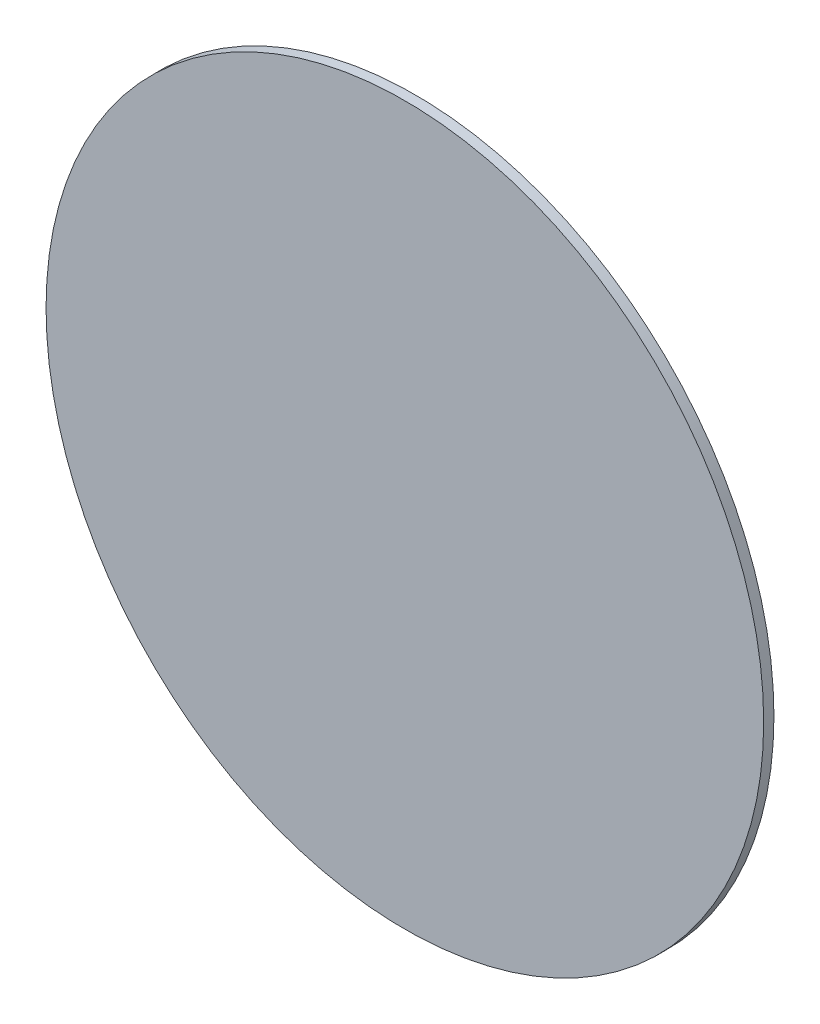
ISO-10303-21;
HEADER;
FILE_DESCRIPTION(('STEP AP214'),'2;1');
FILE_NAME('part.step','',(''),(''),'','','');
FILE_SCHEMA(('AUTOMOTIVE_DESIGN { 1 0 10303 214 1 1 1 1 }'));
ENDSEC;
DATA;
#1=APPLICATION_CONTEXT('core data for automotive mechanical design processes');
#2=APPLICATION_PROTOCOL_DEFINITION('international standard','automotive_design',2000,#1);
#3=PRODUCT_CONTEXT('',#1,'mechanical');
#4=PRODUCT('Part','Part','',(#3));
#5=PRODUCT_RELATED_PRODUCT_CATEGORY('part','',(#4));
#6=PRODUCT_DEFINITION_FORMATION('','',#4);
#7=PRODUCT_DEFINITION_CONTEXT('part definition',#1,'design');
#8=PRODUCT_DEFINITION('design','',#6,#7);
#9=PRODUCT_DEFINITION_SHAPE('','',#8);
#10=(LENGTH_UNIT() NAMED_UNIT(*) SI_UNIT(.MILLI.,.METRE.));
#11=(NAMED_UNIT(*) PLANE_ANGLE_UNIT() SI_UNIT($,.RADIAN.));
#12=(NAMED_UNIT(*) SI_UNIT($,.STERADIAN.) SOLID_ANGLE_UNIT());
#13=UNCERTAINTY_MEASURE_WITH_UNIT(LENGTH_MEASURE(1.E-05),#10,'distance_accuracy_value','');
#14=(GEOMETRIC_REPRESENTATION_CONTEXT(3) GLOBAL_UNCERTAINTY_ASSIGNED_CONTEXT((#13)) GLOBAL_UNIT_ASSIGNED_CONTEXT((#10,
#11,#12)) REPRESENTATION_CONTEXT('',''));
#15=CARTESIAN_POINT('',(0.,0.,0.));
#16=DIRECTION('',(0.,0.,1.));
#17=DIRECTION('',(1.,0.,0.));
#18=AXIS2_PLACEMENT_3D('',#15,#16,#17);
#19=CARTESIAN_POINT('',(0.,0.,5.));
#20=DIRECTION('',(0.,0.,-1.));
#21=DIRECTION('',(-1.,0.,0.));
#22=AXIS2_PLACEMENT_3D('',#19,#20,#21);
#23=CYLINDRICAL_SURFACE('',#22,175.);
#24=CARTESIAN_POINT('',(0.,0.,5.));
#25=DIRECTION('',(0.,0.,1.));
#26=DIRECTION('',(1.,0.,0.));
#27=AXIS2_PLACEMENT_3D('',#24,#25,#26);
#28=CIRCLE('',#27,175.);
#29=CARTESIAN_POINT('',(175.,0.,5.));
#30=VERTEX_POINT('',#29);
#31=EDGE_CURVE('E10',#30,#30,#28,.T.);
#32=ORIENTED_EDGE('',*,*,#31,.F.);
#33=EDGE_LOOP('',(#32));
#34=FACE_BOUND('',#33,.T.);
#35=CARTESIAN_POINT('',(0.,0.,0.));
#36=DIRECTION('',(0.,0.,1.));
#37=DIRECTION('',(1.,0.,0.));
#38=AXIS2_PLACEMENT_3D('',#35,#36,#37);
#39=CIRCLE('',#38,175.);
#40=CARTESIAN_POINT('',(175.,0.,0.));
#41=VERTEX_POINT('',#40);
#42=EDGE_CURVE('E33',#41,#41,#39,.T.);
#43=ORIENTED_EDGE('',*,*,#42,.T.);
#44=EDGE_LOOP('',(#43));
#45=FACE_BOUND('',#44,.T.);
#46=ADVANCED_FACE('F30',(#34,#45),#23,.T.);
#47=CARTESIAN_POINT('',(0.,0.,5.));
#48=DIRECTION('',(0.,0.,1.));
#49=DIRECTION('',(1.,0.,0.));
#50=AXIS2_PLACEMENT_3D('',#47,#48,#49);
#51=PLANE('',#50);
#52=ORIENTED_EDGE('',*,*,#31,.T.);
#53=EDGE_LOOP('',(#52));
#54=FACE_BOUND('',#53,.T.);
#55=ADVANCED_FACE('F45',(#54),#51,.T.);
#56=CARTESIAN_POINT('',(0.,0.,0.));
#57=DIRECTION('',(0.,0.,1.));
#58=DIRECTION('',(1.,0.,0.));
#59=AXIS2_PLACEMENT_3D('',#56,#57,#58);
#60=PLANE('',#59);
#61=ORIENTED_EDGE('',*,*,#42,.F.);
#62=EDGE_LOOP('',(#61));
#63=FACE_BOUND('',#62,.T.);
#64=ADVANCED_FACE('F43',(#63),#60,.F.);
#65=CLOSED_SHELL('',(#46,#55,#64));
#66=MANIFOLD_SOLID_BREP('B2',#65);
#67=ADVANCED_BREP_SHAPE_REPRESENTATION('',(#18,#66),#14);
#68=SHAPE_DEFINITION_REPRESENTATION(#9,#67);
ENDSEC;
END-ISO-10303-21;
